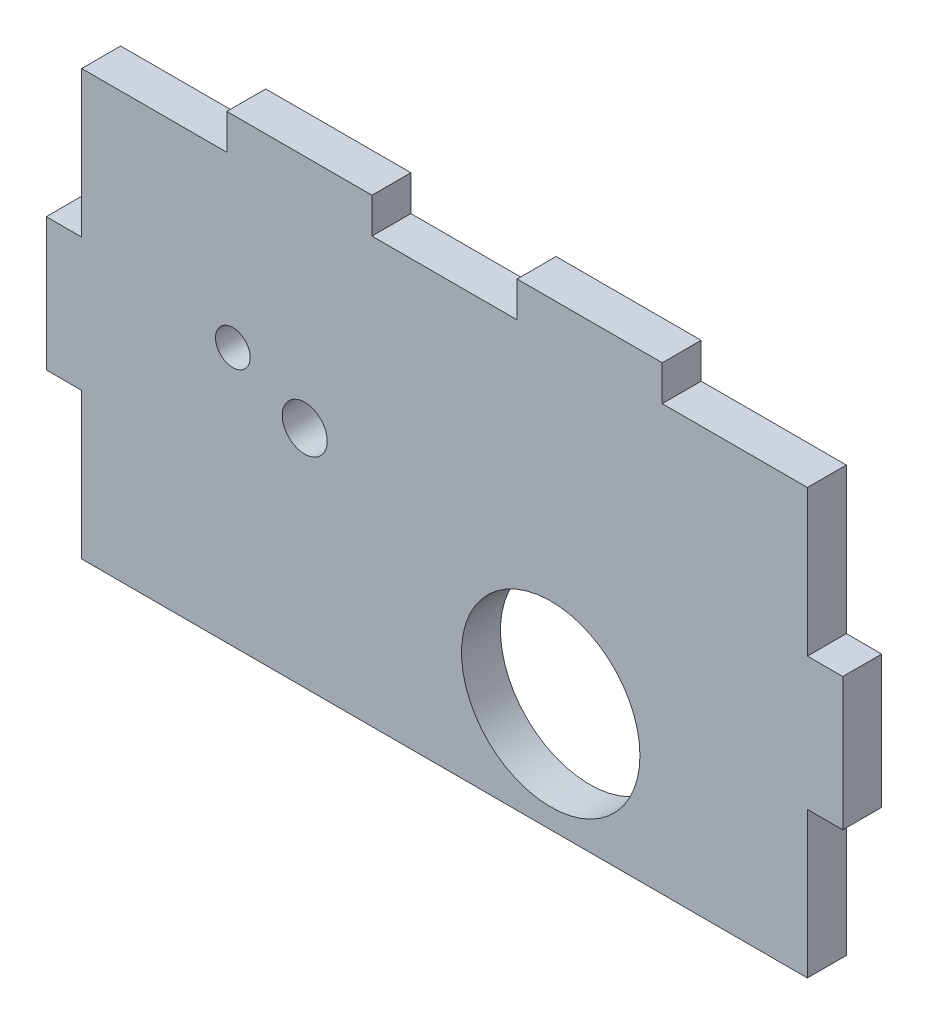
ISO-10303-21;
HEADER;
FILE_DESCRIPTION(('STEP AP214'),'2;1');
FILE_NAME('part.step','',(''),(''),'','','');
FILE_SCHEMA(('AUTOMOTIVE_DESIGN { 1 0 10303 214 1 1 1 1 }'));
ENDSEC;
DATA;
#1=APPLICATION_CONTEXT('core data for automotive mechanical design processes');
#2=APPLICATION_PROTOCOL_DEFINITION('international standard','automotive_design',2000,#1);
#3=PRODUCT_CONTEXT('',#1,'mechanical');
#4=PRODUCT('Part','Part','',(#3));
#5=PRODUCT_RELATED_PRODUCT_CATEGORY('part','',(#4));
#6=PRODUCT_DEFINITION_FORMATION('','',#4);
#7=PRODUCT_DEFINITION_CONTEXT('part definition',#1,'design');
#8=PRODUCT_DEFINITION('design','',#6,#7);
#9=PRODUCT_DEFINITION_SHAPE('','',#8);
#10=(LENGTH_UNIT() NAMED_UNIT(*) SI_UNIT(.MILLI.,.METRE.));
#11=(NAMED_UNIT(*) PLANE_ANGLE_UNIT() SI_UNIT($,.RADIAN.));
#12=(NAMED_UNIT(*) SI_UNIT($,.STERADIAN.) SOLID_ANGLE_UNIT());
#13=UNCERTAINTY_MEASURE_WITH_UNIT(LENGTH_MEASURE(1.E-05),#10,'distance_accuracy_value','');
#14=(GEOMETRIC_REPRESENTATION_CONTEXT(3) GLOBAL_UNCERTAINTY_ASSIGNED_CONTEXT((#13)) GLOBAL_UNIT_ASSIGNED_CONTEXT((#10,
#11,#12)) REPRESENTATION_CONTEXT('',''));
#15=CARTESIAN_POINT('',(0.,0.,0.));
#16=DIRECTION('',(0.,0.,1.));
#17=DIRECTION('',(1.,0.,0.));
#18=AXIS2_PLACEMENT_3D('',#15,#16,#17);
#19=CARTESIAN_POINT('',(0.,0.,5.588));
#20=DIRECTION('',(0.,0.,1.));
#21=DIRECTION('',(1.,0.,0.));
#22=AXIS2_PLACEMENT_3D('',#19,#20,#21);
#23=PLANE('',#22);
#24=CARTESIAN_POINT('',(37.0899556723201,-71.0972176276712,5.588));
#25=DIRECTION('',(0.,0.,1.));
#26=DIRECTION('',(1.,0.,0.));
#27=AXIS2_PLACEMENT_3D('',#24,#25,#26);
#28=CIRCLE('',#27,3.2258000068725);
#29=CARTESIAN_POINT('',(40.3157556791926,-71.0972176276712,5.588));
#30=VERTEX_POINT('',#29);
#31=EDGE_CURVE('E391',#30,#30,#28,.T.);
#32=ORIENTED_EDGE('',*,*,#31,.F.);
#33=EDGE_LOOP('',(#32));
#34=FACE_BOUND('',#33,.T.);
#35=DIRECTION('',(-1.,0.,0.));
#36=VECTOR('',#35,1.);
#37=CARTESIAN_POINT('',(5.07999999998545,-42.3993351543391,5.588));
#38=LINE('',#37,#36);
#39=CARTESIAN_POINT('',(25.9079999999854,-42.3993351543391,5.588));
#40=VERTEX_POINT('',#39);
#41=CARTESIAN_POINT('',(5.07999999998545,-42.3993351543391,5.588));
#42=VERTEX_POINT('',#41);
#43=EDGE_CURVE('E241',#40,#42,#38,.T.);
#44=ORIENTED_EDGE('',*,*,#43,.T.);
#45=DIRECTION('',(0.,-1.,0.));
#46=VECTOR('',#45,1.);
#47=CARTESIAN_POINT('',(5.07999999998545,-42.3993351543391,5.588));
#48=LINE('',#47,#46);
#49=CARTESIAN_POINT('',(5.07999999998545,-63.3543351543391,5.588));
#50=VERTEX_POINT('',#49);
#51=EDGE_CURVE('E129',#42,#50,#48,.T.);
#52=ORIENTED_EDGE('',*,*,#51,.T.);
#53=DIRECTION('',(-1.,0.,0.));
#54=VECTOR('',#53,1.);
#55=CARTESIAN_POINT('',(5.07999999998545,-63.3543351543391,5.588));
#56=LINE('',#55,#54);
#57=CARTESIAN_POINT('',(0.,-63.3543351543391,5.588));
#58=VERTEX_POINT('',#57);
#59=EDGE_CURVE('E292',#50,#58,#56,.T.);
#60=ORIENTED_EDGE('',*,*,#59,.T.);
#61=DIRECTION('',(0.,-1.,0.));
#62=VECTOR('',#61,1.);
#63=CARTESIAN_POINT('',(0.,-63.3543351543391,5.588));
#64=LINE('',#63,#62);
#65=CARTESIAN_POINT('',(0.,-82.4043351543391,5.588));
#66=VERTEX_POINT('',#65);
#67=EDGE_CURVE('E311',#58,#66,#64,.T.);
#68=ORIENTED_EDGE('',*,*,#67,.T.);
#69=DIRECTION('',(1.,0.,0.));
#70=VECTOR('',#69,1.);
#71=CARTESIAN_POINT('',(5.07999999998545,-82.4043351543391,5.588));
#72=LINE('',#71,#70);
#73=CARTESIAN_POINT('',(5.07999999998545,-82.4043351543391,5.588));
#74=VERTEX_POINT('',#73);
#75=EDGE_CURVE('E308',#66,#74,#72,.T.);
#76=ORIENTED_EDGE('',*,*,#75,.T.);
#77=DIRECTION('',(0.,-1.,0.));
#78=VECTOR('',#77,1.);
#79=CARTESIAN_POINT('',(5.07999999998545,-82.4043351543391,5.588));
#80=LINE('',#79,#78);
#81=CARTESIAN_POINT('',(5.07999999998546,-103.359335154339,5.588));
#82=VERTEX_POINT('',#81);
#83=EDGE_CURVE('E310',#74,#82,#80,.T.);
#84=ORIENTED_EDGE('',*,*,#83,.T.);
#85=DIRECTION('',(1.,0.,0.));
#86=VECTOR('',#85,1.);
#87=CARTESIAN_POINT('',(5.07999999998546,-103.359335154339,5.588));
#88=LINE('',#87,#86);
#89=CARTESIAN_POINT('',(109.219999999985,-103.359335154339,5.588));
#90=VERTEX_POINT('',#89);
#91=EDGE_CURVE('E313',#82,#90,#88,.T.);
#92=ORIENTED_EDGE('',*,*,#91,.T.);
#93=DIRECTION('',(0.,1.,0.));
#94=VECTOR('',#93,1.);
#95=CARTESIAN_POINT('',(109.219999999985,-82.404335154339,5.588));
#96=LINE('',#95,#94);
#97=CARTESIAN_POINT('',(109.219999999985,-82.404335154339,5.588));
#98=VERTEX_POINT('',#97);
#99=EDGE_CURVE('E319',#90,#98,#96,.T.);
#100=ORIENTED_EDGE('',*,*,#99,.T.);
#101=DIRECTION('',(1.,0.,0.));
#102=VECTOR('',#101,1.);
#103=CARTESIAN_POINT('',(109.219999999985,-82.404335154339,5.588));
#104=LINE('',#103,#102);
#105=CARTESIAN_POINT('',(114.3,-82.4043351543391,5.588));
#106=VERTEX_POINT('',#105);
#107=EDGE_CURVE('E321',#98,#106,#104,.T.);
#108=ORIENTED_EDGE('',*,*,#107,.T.);
#109=DIRECTION('',(0.,1.,0.));
#110=VECTOR('',#109,1.);
#111=CARTESIAN_POINT('',(114.3,-63.3543351543391,5.588));
#112=LINE('',#111,#110);
#113=CARTESIAN_POINT('',(114.3,-63.3543351543391,5.588));
#114=VERTEX_POINT('',#113);
#115=EDGE_CURVE('E323',#106,#114,#112,.T.);
#116=ORIENTED_EDGE('',*,*,#115,.T.);
#117=DIRECTION('',(-1.,0.,0.));
#118=VECTOR('',#117,1.);
#119=CARTESIAN_POINT('',(109.219999999985,-63.354335154339,5.588));
#120=LINE('',#119,#118);
#121=CARTESIAN_POINT('',(109.219999999985,-63.354335154339,5.588));
#122=VERTEX_POINT('',#121);
#123=EDGE_CURVE('E325',#114,#122,#120,.T.);
#124=ORIENTED_EDGE('',*,*,#123,.T.);
#125=DIRECTION('',(0.,1.,0.));
#126=VECTOR('',#125,1.);
#127=CARTESIAN_POINT('',(109.219999999985,-42.399335154339,5.588));
#128=LINE('',#127,#126);
#129=CARTESIAN_POINT('',(109.219999999985,-42.399335154339,5.588));
#130=VERTEX_POINT('',#129);
#131=EDGE_CURVE('E327',#122,#130,#128,.T.);
#132=ORIENTED_EDGE('',*,*,#131,.T.);
#133=DIRECTION('',(-1.,0.,0.));
#134=VECTOR('',#133,1.);
#135=CARTESIAN_POINT('',(88.3919999999854,-42.399335154339,5.588));
#136=LINE('',#135,#134);
#137=CARTESIAN_POINT('',(88.3919999999854,-42.399335154339,5.588));
#138=VERTEX_POINT('',#137);
#139=EDGE_CURVE('E329',#130,#138,#136,.T.);
#140=ORIENTED_EDGE('',*,*,#139,.T.);
#141=DIRECTION('',(0.,1.,0.));
#142=VECTOR('',#141,1.);
#143=CARTESIAN_POINT('',(88.3919999999854,-42.399335154339,5.588));
#144=LINE('',#143,#142);
#145=CARTESIAN_POINT('',(88.3919999999854,-37.319335154339,5.588));
#146=VERTEX_POINT('',#145);
#147=EDGE_CURVE('E331',#138,#146,#144,.T.);
#148=ORIENTED_EDGE('',*,*,#147,.T.);
#149=DIRECTION('',(-1.,0.,0.));
#150=VECTOR('',#149,1.);
#151=CARTESIAN_POINT('',(67.5639999999854,-37.319335154339,5.588));
#152=LINE('',#151,#150);
#153=CARTESIAN_POINT('',(67.5639999999854,-37.319335154339,5.588));
#154=VERTEX_POINT('',#153);
#155=EDGE_CURVE('E333',#146,#154,#152,.T.);
#156=ORIENTED_EDGE('',*,*,#155,.T.);
#157=DIRECTION('',(0.,-1.,0.));
#158=VECTOR('',#157,1.);
#159=CARTESIAN_POINT('',(67.5639999999854,-42.399335154339,5.588));
#160=LINE('',#159,#158);
#161=CARTESIAN_POINT('',(67.5639999999854,-42.399335154339,5.588));
#162=VERTEX_POINT('',#161);
#163=EDGE_CURVE('E335',#154,#162,#160,.T.);
#164=ORIENTED_EDGE('',*,*,#163,.T.);
#165=DIRECTION('',(-1.,0.,0.));
#166=VECTOR('',#165,1.);
#167=CARTESIAN_POINT('',(46.7359999999854,-42.3993351543391,5.588));
#168=LINE('',#167,#166);
#169=CARTESIAN_POINT('',(46.7359999999854,-42.3993351543391,5.588));
#170=VERTEX_POINT('',#169);
#171=EDGE_CURVE('E184',#162,#170,#168,.T.);
#172=ORIENTED_EDGE('',*,*,#171,.T.);
#173=DIRECTION('',(0.,1.,0.));
#174=VECTOR('',#173,1.);
#175=CARTESIAN_POINT('',(46.7359999999854,-42.3993351543391,5.588));
#176=LINE('',#175,#174);
#177=CARTESIAN_POINT('',(46.7359999999854,-37.319335154339,5.588));
#178=VERTEX_POINT('',#177);
#179=EDGE_CURVE('E178',#170,#178,#176,.T.);
#180=ORIENTED_EDGE('',*,*,#179,.T.);
#181=DIRECTION('',(-1.,0.,0.));
#182=VECTOR('',#181,1.);
#183=CARTESIAN_POINT('',(25.9079999999854,-37.319335154339,5.588));
#184=LINE('',#183,#182);
#185=CARTESIAN_POINT('',(25.9079999999854,-37.319335154339,5.588));
#186=VERTEX_POINT('',#185);
#187=EDGE_CURVE('E182',#178,#186,#184,.T.);
#188=ORIENTED_EDGE('',*,*,#187,.T.);
#189=DIRECTION('',(0.,-1.,0.));
#190=VECTOR('',#189,1.);
#191=CARTESIAN_POINT('',(25.9079999999854,-42.3993351543391,5.588));
#192=LINE('',#191,#190);
#193=EDGE_CURVE('E50',#186,#40,#192,.T.);
#194=ORIENTED_EDGE('',*,*,#193,.T.);
#195=EDGE_LOOP('',(#44,#52,#60,#68,#76,#84,#92,#100,#108,#116,#124,#132,#140,#148,#156,#164,
#172,#180,#188,#194));
#196=FACE_BOUND('',#195,.T.);
#197=CARTESIAN_POINT('',(26.7727338848748,-66.2371933737541,5.588));
#198=DIRECTION('',(0.,0.,1.));
#199=DIRECTION('',(1.,0.,0.));
#200=AXIS2_PLACEMENT_3D('',#197,#198,#199);
#201=CIRCLE('',#200,2.4892000068725);
#202=CARTESIAN_POINT('',(29.2619338917473,-66.2371933737541,5.588));
#203=VERTEX_POINT('',#202);
#204=EDGE_CURVE('E206',#203,#203,#201,.T.);
#205=ORIENTED_EDGE('',*,*,#204,.F.);
#206=EDGE_LOOP('',(#205));
#207=FACE_BOUND('',#206,.T.);
#208=CARTESIAN_POINT('',(72.3900000000002,-87.725635154339,5.588));
#209=DIRECTION('',(0.,0.,1.));
#210=DIRECTION('',(1.,0.,0.));
#211=AXIS2_PLACEMENT_3D('',#208,#209,#210);
#212=CIRCLE('',#211,12.8016000048525);
#213=CARTESIAN_POINT('',(85.1916000048526,-87.725635154339,5.588));
#214=VERTEX_POINT('',#213);
#215=EDGE_CURVE('E382',#214,#214,#212,.T.);
#216=ORIENTED_EDGE('',*,*,#215,.F.);
#217=EDGE_LOOP('',(#216));
#218=FACE_BOUND('',#217,.T.);
#219=ADVANCED_FACE('F33',(#34,#196,#207,#218),#23,.T.);
#220=CARTESIAN_POINT('',(0.,0.,0.));
#221=DIRECTION('',(0.,0.,1.));
#222=DIRECTION('',(1.,0.,0.));
#223=AXIS2_PLACEMENT_3D('',#220,#221,#222);
#224=PLANE('',#223);
#225=CARTESIAN_POINT('',(37.0899556723201,-71.0972176276712,0.));
#226=DIRECTION('',(0.,0.,1.));
#227=DIRECTION('',(1.,0.,0.));
#228=AXIS2_PLACEMENT_3D('',#225,#226,#227);
#229=CIRCLE('',#228,3.2258000068725);
#230=CARTESIAN_POINT('',(40.3157556791926,-71.0972176276712,0.));
#231=VERTEX_POINT('',#230);
#232=EDGE_CURVE('E388',#231,#231,#229,.T.);
#233=ORIENTED_EDGE('',*,*,#232,.T.);
#234=EDGE_LOOP('',(#233));
#235=FACE_BOUND('',#234,.T.);
#236=DIRECTION('',(-1.,0.,0.));
#237=VECTOR('',#236,1.);
#238=CARTESIAN_POINT('',(5.07999999998545,-42.3993351543391,0.));
#239=LINE('',#238,#237);
#240=CARTESIAN_POINT('',(25.9079999999854,-42.3993351543391,0.));
#241=VERTEX_POINT('',#240);
#242=CARTESIAN_POINT('',(5.07999999998545,-42.3993351543391,0.));
#243=VERTEX_POINT('',#242);
#244=EDGE_CURVE('E202',#241,#243,#239,.T.);
#245=ORIENTED_EDGE('',*,*,#244,.F.);
#246=DIRECTION('',(0.,-1.,0.));
#247=VECTOR('',#246,1.);
#248=CARTESIAN_POINT('',(25.9079999999854,-42.3993351543391,0.));
#249=LINE('',#248,#247);
#250=CARTESIAN_POINT('',(25.9079999999854,-37.319335154339,0.));
#251=VERTEX_POINT('',#250);
#252=EDGE_CURVE('E121',#251,#241,#249,.T.);
#253=ORIENTED_EDGE('',*,*,#252,.F.);
#254=DIRECTION('',(-1.,0.,0.));
#255=VECTOR('',#254,1.);
#256=CARTESIAN_POINT('',(25.9079999999854,-37.319335154339,0.));
#257=LINE('',#256,#255);
#258=CARTESIAN_POINT('',(46.7359999999854,-37.319335154339,0.));
#259=VERTEX_POINT('',#258);
#260=EDGE_CURVE('E115',#259,#251,#257,.T.);
#261=ORIENTED_EDGE('',*,*,#260,.F.);
#262=DIRECTION('',(0.,1.,0.));
#263=VECTOR('',#262,1.);
#264=CARTESIAN_POINT('',(46.7359999999854,-42.3993351543391,0.));
#265=LINE('',#264,#263);
#266=CARTESIAN_POINT('',(46.7359999999854,-42.3993351543391,0.));
#267=VERTEX_POINT('',#266);
#268=EDGE_CURVE('E192',#267,#259,#265,.T.);
#269=ORIENTED_EDGE('',*,*,#268,.F.);
#270=DIRECTION('',(-1.,0.,0.));
#271=VECTOR('',#270,1.);
#272=CARTESIAN_POINT('',(46.7359999999854,-42.3993351543391,0.));
#273=LINE('',#272,#271);
#274=CARTESIAN_POINT('',(67.5639999999854,-42.399335154339,0.));
#275=VERTEX_POINT('',#274);
#276=EDGE_CURVE('E236',#275,#267,#273,.T.);
#277=ORIENTED_EDGE('',*,*,#276,.F.);
#278=DIRECTION('',(0.,-1.,0.));
#279=VECTOR('',#278,1.);
#280=CARTESIAN_POINT('',(67.5639999999854,-42.399335154339,0.));
#281=LINE('',#280,#279);
#282=CARTESIAN_POINT('',(67.5639999999854,-37.319335154339,0.));
#283=VERTEX_POINT('',#282);
#284=EDGE_CURVE('E234',#283,#275,#281,.T.);
#285=ORIENTED_EDGE('',*,*,#284,.F.);
#286=DIRECTION('',(-1.,0.,0.));
#287=VECTOR('',#286,1.);
#288=CARTESIAN_POINT('',(67.5639999999854,-37.319335154339,0.));
#289=LINE('',#288,#287);
#290=CARTESIAN_POINT('',(88.3919999999854,-37.319335154339,0.));
#291=VERTEX_POINT('',#290);
#292=EDGE_CURVE('E232',#291,#283,#289,.T.);
#293=ORIENTED_EDGE('',*,*,#292,.F.);
#294=DIRECTION('',(0.,1.,0.));
#295=VECTOR('',#294,1.);
#296=CARTESIAN_POINT('',(88.3919999999854,-42.399335154339,0.));
#297=LINE('',#296,#295);
#298=CARTESIAN_POINT('',(88.3919999999854,-42.399335154339,0.));
#299=VERTEX_POINT('',#298);
#300=EDGE_CURVE('E230',#299,#291,#297,.T.);
#301=ORIENTED_EDGE('',*,*,#300,.F.);
#302=DIRECTION('',(-1.,0.,0.));
#303=VECTOR('',#302,1.);
#304=CARTESIAN_POINT('',(88.3919999999854,-42.399335154339,0.));
#305=LINE('',#304,#303);
#306=CARTESIAN_POINT('',(109.219999999985,-42.399335154339,0.));
#307=VERTEX_POINT('',#306);
#308=EDGE_CURVE('E228',#307,#299,#305,.T.);
#309=ORIENTED_EDGE('',*,*,#308,.F.);
#310=DIRECTION('',(0.,1.,0.));
#311=VECTOR('',#310,1.);
#312=CARTESIAN_POINT('',(109.219999999985,-42.399335154339,0.));
#313=LINE('',#312,#311);
#314=CARTESIAN_POINT('',(109.219999999985,-63.354335154339,0.));
#315=VERTEX_POINT('',#314);
#316=EDGE_CURVE('E226',#315,#307,#313,.T.);
#317=ORIENTED_EDGE('',*,*,#316,.F.);
#318=DIRECTION('',(-1.,0.,0.));
#319=VECTOR('',#318,1.);
#320=CARTESIAN_POINT('',(109.219999999985,-63.354335154339,0.));
#321=LINE('',#320,#319);
#322=CARTESIAN_POINT('',(114.3,-63.3543351543391,0.));
#323=VERTEX_POINT('',#322);
#324=EDGE_CURVE('E224',#323,#315,#321,.T.);
#325=ORIENTED_EDGE('',*,*,#324,.F.);
#326=DIRECTION('',(0.,1.,0.));
#327=VECTOR('',#326,1.);
#328=CARTESIAN_POINT('',(114.3,-63.3543351543391,0.));
#329=LINE('',#328,#327);
#330=CARTESIAN_POINT('',(114.3,-82.4043351543391,0.));
#331=VERTEX_POINT('',#330);
#332=EDGE_CURVE('E222',#331,#323,#329,.T.);
#333=ORIENTED_EDGE('',*,*,#332,.F.);
#334=DIRECTION('',(1.,0.,0.));
#335=VECTOR('',#334,1.);
#336=CARTESIAN_POINT('',(109.219999999985,-82.404335154339,0.));
#337=LINE('',#336,#335);
#338=CARTESIAN_POINT('',(109.219999999985,-82.404335154339,0.));
#339=VERTEX_POINT('',#338);
#340=EDGE_CURVE('E220',#339,#331,#337,.T.);
#341=ORIENTED_EDGE('',*,*,#340,.F.);
#342=DIRECTION('',(0.,1.,0.));
#343=VECTOR('',#342,1.);
#344=CARTESIAN_POINT('',(109.219999999985,-82.404335154339,0.));
#345=LINE('',#344,#343);
#346=CARTESIAN_POINT('',(109.219999999985,-103.359335154339,0.));
#347=VERTEX_POINT('',#346);
#348=EDGE_CURVE('E218',#347,#339,#345,.T.);
#349=ORIENTED_EDGE('',*,*,#348,.F.);
#350=DIRECTION('',(1.,0.,0.));
#351=VECTOR('',#350,1.);
#352=CARTESIAN_POINT('',(5.07999999998546,-103.359335154339,0.));
#353=LINE('',#352,#351);
#354=CARTESIAN_POINT('',(5.07999999998546,-103.359335154339,0.));
#355=VERTEX_POINT('',#354);
#356=EDGE_CURVE('E216',#355,#347,#353,.T.);
#357=ORIENTED_EDGE('',*,*,#356,.F.);
#358=DIRECTION('',(0.,-1.,0.));
#359=VECTOR('',#358,1.);
#360=CARTESIAN_POINT('',(5.07999999998545,-82.4043351543391,0.));
#361=LINE('',#360,#359);
#362=CARTESIAN_POINT('',(5.07999999998545,-82.4043351543391,0.));
#363=VERTEX_POINT('',#362);
#364=EDGE_CURVE('E214',#363,#355,#361,.T.);
#365=ORIENTED_EDGE('',*,*,#364,.F.);
#366=DIRECTION('',(1.,0.,0.));
#367=VECTOR('',#366,1.);
#368=CARTESIAN_POINT('',(5.07999999998545,-82.4043351543391,0.));
#369=LINE('',#368,#367);
#370=CARTESIAN_POINT('',(0.,-82.4043351543391,0.));
#371=VERTEX_POINT('',#370);
#372=EDGE_CURVE('E212',#371,#363,#369,.T.);
#373=ORIENTED_EDGE('',*,*,#372,.F.);
#374=DIRECTION('',(0.,-1.,0.));
#375=VECTOR('',#374,1.);
#376=CARTESIAN_POINT('',(0.,-63.3543351543391,0.));
#377=LINE('',#376,#375);
#378=CARTESIAN_POINT('',(0.,-63.3543351543391,0.));
#379=VERTEX_POINT('',#378);
#380=EDGE_CURVE('E210',#379,#371,#377,.T.);
#381=ORIENTED_EDGE('',*,*,#380,.F.);
#382=DIRECTION('',(-1.,0.,0.));
#383=VECTOR('',#382,1.);
#384=CARTESIAN_POINT('',(5.07999999998545,-63.3543351543391,0.));
#385=LINE('',#384,#383);
#386=CARTESIAN_POINT('',(5.07999999998545,-63.3543351543391,0.));
#387=VERTEX_POINT('',#386);
#388=EDGE_CURVE('E208',#387,#379,#385,.T.);
#389=ORIENTED_EDGE('',*,*,#388,.F.);
#390=DIRECTION('',(0.,-1.,0.));
#391=VECTOR('',#390,1.);
#392=CARTESIAN_POINT('',(5.07999999998545,-42.3993351543391,0.));
#393=LINE('',#392,#391);
#394=EDGE_CURVE('E205',#243,#387,#393,.T.);
#395=ORIENTED_EDGE('',*,*,#394,.F.);
#396=EDGE_LOOP('',(#245,#253,#261,#269,#277,#285,#293,#301,#309,#317,#325,#333,#341,#349,#357,
#365,#373,#381,#389,#395));
#397=FACE_BOUND('',#396,.T.);
#398=CARTESIAN_POINT('',(26.7727338848748,-66.2371933737541,0.));
#399=DIRECTION('',(0.,0.,1.));
#400=DIRECTION('',(1.,0.,0.));
#401=AXIS2_PLACEMENT_3D('',#398,#399,#400);
#402=CIRCLE('',#401,2.4892000068725);
#403=CARTESIAN_POINT('',(29.2619338917473,-66.2371933737541,0.));
#404=VERTEX_POINT('',#403);
#405=EDGE_CURVE('E394',#404,#404,#402,.T.);
#406=ORIENTED_EDGE('',*,*,#405,.T.);
#407=EDGE_LOOP('',(#406));
#408=FACE_BOUND('',#407,.T.);
#409=CARTESIAN_POINT('',(72.3900000000002,-87.725635154339,0.));
#410=DIRECTION('',(0.,0.,1.));
#411=DIRECTION('',(1.,0.,0.));
#412=AXIS2_PLACEMENT_3D('',#409,#410,#411);
#413=CIRCLE('',#412,12.8016000048525);
#414=CARTESIAN_POINT('',(85.1916000048526,-87.725635154339,0.));
#415=VERTEX_POINT('',#414);
#416=EDGE_CURVE('E385',#415,#415,#413,.T.);
#417=ORIENTED_EDGE('',*,*,#416,.T.);
#418=EDGE_LOOP('',(#417));
#419=FACE_BOUND('',#418,.T.);
#420=ADVANCED_FACE('F296',(#235,#397,#408,#419),#224,.F.);
#421=CARTESIAN_POINT('',(5.07999999998545,-42.3993351543391,5.588));
#422=DIRECTION('',(0.,-1.,0.));
#423=DIRECTION('',(1.,0.,0.));
#424=AXIS2_PLACEMENT_3D('',#421,#422,#423);
#425=PLANE('',#424);
#426=ORIENTED_EDGE('',*,*,#244,.T.);
#427=DIRECTION('',(0.,0.,-1.));
#428=VECTOR('',#427,1.);
#429=CARTESIAN_POINT('',(5.07999999998545,-42.3993351543391,5.588));
#430=LINE('',#429,#428);
#431=EDGE_CURVE('E11',#42,#243,#430,.T.);
#432=ORIENTED_EDGE('',*,*,#431,.F.);
#433=ORIENTED_EDGE('',*,*,#43,.F.);
#434=DIRECTION('',(0.,0.,-1.));
#435=VECTOR('',#434,1.);
#436=CARTESIAN_POINT('',(25.9079999999854,-42.3993351543391,5.588));
#437=LINE('',#436,#435);
#438=EDGE_CURVE('E198',#40,#241,#437,.T.);
#439=ORIENTED_EDGE('',*,*,#438,.T.);
#440=EDGE_LOOP('',(#426,#432,#433,#439));
#441=FACE_BOUND('',#440,.T.);
#442=ADVANCED_FACE('F35',(#441),#425,.F.);
#443=CARTESIAN_POINT('',(5.07999999998545,-42.3993351543391,5.588));
#444=DIRECTION('',(1.,0.,0.));
#445=DIRECTION('',(0.,1.,0.));
#446=AXIS2_PLACEMENT_3D('',#443,#444,#445);
#447=PLANE('',#446);
#448=ORIENTED_EDGE('',*,*,#394,.T.);
#449=DIRECTION('',(0.,0.,-1.));
#450=VECTOR('',#449,1.);
#451=CARTESIAN_POINT('',(5.07999999998545,-63.3543351543391,5.588));
#452=LINE('',#451,#450);
#453=EDGE_CURVE('E42',#50,#387,#452,.T.);
#454=ORIENTED_EDGE('',*,*,#453,.F.);
#455=ORIENTED_EDGE('',*,*,#51,.F.);
#456=ORIENTED_EDGE('',*,*,#431,.T.);
#457=EDGE_LOOP('',(#448,#454,#455,#456));
#458=FACE_BOUND('',#457,.T.);
#459=ADVANCED_FACE('F575',(#458),#447,.F.);
#460=CARTESIAN_POINT('',(5.07999999998545,-63.3543351543391,5.588));
#461=DIRECTION('',(0.,-1.,0.));
#462=DIRECTION('',(0.,0.,-1.));
#463=AXIS2_PLACEMENT_3D('',#460,#461,#462);
#464=PLANE('',#463);
#465=ORIENTED_EDGE('',*,*,#388,.T.);
#466=DIRECTION('',(0.,0.,-1.));
#467=VECTOR('',#466,1.);
#468=CARTESIAN_POINT('',(0.,-63.3543351543391,5.588));
#469=LINE('',#468,#467);
#470=EDGE_CURVE('E284',#58,#379,#469,.T.);
#471=ORIENTED_EDGE('',*,*,#470,.F.);
#472=ORIENTED_EDGE('',*,*,#59,.F.);
#473=ORIENTED_EDGE('',*,*,#453,.T.);
#474=EDGE_LOOP('',(#465,#471,#472,#473));
#475=FACE_BOUND('',#474,.T.);
#476=ADVANCED_FACE('F290',(#475),#464,.F.);
#477=CARTESIAN_POINT('',(0.,-63.3543351543391,5.588));
#478=DIRECTION('',(1.,0.,0.));
#479=DIRECTION('',(0.,0.,-1.));
#480=AXIS2_PLACEMENT_3D('',#477,#478,#479);
#481=PLANE('',#480);
#482=ORIENTED_EDGE('',*,*,#380,.T.);
#483=DIRECTION('',(0.,0.,-1.));
#484=VECTOR('',#483,1.);
#485=CARTESIAN_POINT('',(0.,-82.4043351543391,5.588));
#486=LINE('',#485,#484);
#487=EDGE_CURVE('E281',#66,#371,#486,.T.);
#488=ORIENTED_EDGE('',*,*,#487,.F.);
#489=ORIENTED_EDGE('',*,*,#67,.F.);
#490=ORIENTED_EDGE('',*,*,#470,.T.);
#491=EDGE_LOOP('',(#482,#488,#489,#490));
#492=FACE_BOUND('',#491,.T.);
#493=ADVANCED_FACE('F302',(#492),#481,.F.);
#494=CARTESIAN_POINT('',(5.07999999998545,-82.4043351543391,5.588));
#495=DIRECTION('',(0.,1.,0.));
#496=DIRECTION('',(0.,0.,1.));
#497=AXIS2_PLACEMENT_3D('',#494,#495,#496);
#498=PLANE('',#497);
#499=ORIENTED_EDGE('',*,*,#372,.T.);
#500=DIRECTION('',(0.,0.,-1.));
#501=VECTOR('',#500,1.);
#502=CARTESIAN_POINT('',(5.07999999998545,-82.4043351543391,5.588));
#503=LINE('',#502,#501);
#504=EDGE_CURVE('E278',#74,#363,#503,.T.);
#505=ORIENTED_EDGE('',*,*,#504,.F.);
#506=ORIENTED_EDGE('',*,*,#75,.F.);
#507=ORIENTED_EDGE('',*,*,#487,.T.);
#508=EDGE_LOOP('',(#499,#505,#506,#507));
#509=FACE_BOUND('',#508,.T.);
#510=ADVANCED_FACE('F306',(#509),#498,.F.);
#511=CARTESIAN_POINT('',(5.07999999998545,-82.4043351543391,5.588));
#512=DIRECTION('',(1.,0.,0.));
#513=DIRECTION('',(0.,1.,0.));
#514=AXIS2_PLACEMENT_3D('',#511,#512,#513);
#515=PLANE('',#514);
#516=ORIENTED_EDGE('',*,*,#364,.T.);
#517=DIRECTION('',(0.,0.,-1.));
#518=VECTOR('',#517,1.);
#519=CARTESIAN_POINT('',(5.07999999998546,-103.359335154339,5.588));
#520=LINE('',#519,#518);
#521=EDGE_CURVE('E275',#82,#355,#520,.T.);
#522=ORIENTED_EDGE('',*,*,#521,.F.);
#523=ORIENTED_EDGE('',*,*,#83,.F.);
#524=ORIENTED_EDGE('',*,*,#504,.T.);
#525=EDGE_LOOP('',(#516,#522,#523,#524));
#526=FACE_BOUND('',#525,.T.);
#527=ADVANCED_FACE('F540',(#526),#515,.F.);
#528=CARTESIAN_POINT('',(5.07999999998546,-103.359335154339,5.588));
#529=DIRECTION('',(0.,1.,0.));
#530=DIRECTION('',(-1.,0.,0.));
#531=AXIS2_PLACEMENT_3D('',#528,#529,#530);
#532=PLANE('',#531);
#533=ORIENTED_EDGE('',*,*,#356,.T.);
#534=DIRECTION('',(0.,0.,-1.));
#535=VECTOR('',#534,1.);
#536=CARTESIAN_POINT('',(109.219999999985,-103.359335154339,5.588));
#537=LINE('',#536,#535);
#538=EDGE_CURVE('E272',#90,#347,#537,.T.);
#539=ORIENTED_EDGE('',*,*,#538,.F.);
#540=ORIENTED_EDGE('',*,*,#91,.F.);
#541=ORIENTED_EDGE('',*,*,#521,.T.);
#542=EDGE_LOOP('',(#533,#539,#540,#541));
#543=FACE_BOUND('',#542,.T.);
#544=ADVANCED_FACE('F530',(#543),#532,.F.);
#545=CARTESIAN_POINT('',(109.219999999985,-82.404335154339,5.588));
#546=DIRECTION('',(-1.,0.,0.));
#547=DIRECTION('',(0.,0.,1.));
#548=AXIS2_PLACEMENT_3D('',#545,#546,#547);
#549=PLANE('',#548);
#550=ORIENTED_EDGE('',*,*,#348,.T.);
#551=DIRECTION('',(0.,0.,-1.));
#552=VECTOR('',#551,1.);
#553=CARTESIAN_POINT('',(109.219999999985,-82.404335154339,5.588));
#554=LINE('',#553,#552);
#555=EDGE_CURVE('E269',#98,#339,#554,.T.);
#556=ORIENTED_EDGE('',*,*,#555,.F.);
#557=ORIENTED_EDGE('',*,*,#99,.F.);
#558=ORIENTED_EDGE('',*,*,#538,.T.);
#559=EDGE_LOOP('',(#550,#556,#557,#558));
#560=FACE_BOUND('',#559,.T.);
#561=ADVANCED_FACE('F520',(#560),#549,.F.);
#562=CARTESIAN_POINT('',(109.219999999985,-82.404335154339,5.588));
#563=DIRECTION('',(0.,1.,0.));
#564=DIRECTION('',(-1.,0.,0.));
#565=AXIS2_PLACEMENT_3D('',#562,#563,#564);
#566=PLANE('',#565);
#567=ORIENTED_EDGE('',*,*,#340,.T.);
#568=DIRECTION('',(0.,0.,-1.));
#569=VECTOR('',#568,1.);
#570=CARTESIAN_POINT('',(114.3,-82.4043351543391,5.588));
#571=LINE('',#570,#569);
#572=EDGE_CURVE('E266',#106,#331,#571,.T.);
#573=ORIENTED_EDGE('',*,*,#572,.F.);
#574=ORIENTED_EDGE('',*,*,#107,.F.);
#575=ORIENTED_EDGE('',*,*,#555,.T.);
#576=EDGE_LOOP('',(#567,#573,#574,#575));
#577=FACE_BOUND('',#576,.T.);
#578=ADVANCED_FACE('F510',(#577),#566,.F.);
#579=CARTESIAN_POINT('',(114.3,-63.3543351543391,5.588));
#580=DIRECTION('',(-1.,0.,0.));
#581=DIRECTION('',(0.,0.,1.));
#582=AXIS2_PLACEMENT_3D('',#579,#580,#581);
#583=PLANE('',#582);
#584=ORIENTED_EDGE('',*,*,#332,.T.);
#585=DIRECTION('',(0.,0.,-1.));
#586=VECTOR('',#585,1.);
#587=CARTESIAN_POINT('',(114.3,-63.3543351543391,5.588));
#588=LINE('',#587,#586);
#589=EDGE_CURVE('E263',#114,#323,#588,.T.);
#590=ORIENTED_EDGE('',*,*,#589,.F.);
#591=ORIENTED_EDGE('',*,*,#115,.F.);
#592=ORIENTED_EDGE('',*,*,#572,.T.);
#593=EDGE_LOOP('',(#584,#590,#591,#592));
#594=FACE_BOUND('',#593,.T.);
#595=ADVANCED_FACE('F500',(#594),#583,.F.);
#596=CARTESIAN_POINT('',(109.219999999985,-63.354335154339,5.588));
#597=DIRECTION('',(0.,-1.,0.));
#598=DIRECTION('',(1.,0.,0.));
#599=AXIS2_PLACEMENT_3D('',#596,#597,#598);
#600=PLANE('',#599);
#601=ORIENTED_EDGE('',*,*,#324,.T.);
#602=DIRECTION('',(0.,0.,-1.));
#603=VECTOR('',#602,1.);
#604=CARTESIAN_POINT('',(109.219999999985,-63.354335154339,5.588));
#605=LINE('',#604,#603);
#606=EDGE_CURVE('E260',#122,#315,#605,.T.);
#607=ORIENTED_EDGE('',*,*,#606,.F.);
#608=ORIENTED_EDGE('',*,*,#123,.F.);
#609=ORIENTED_EDGE('',*,*,#589,.T.);
#610=EDGE_LOOP('',(#601,#607,#608,#609));
#611=FACE_BOUND('',#610,.T.);
#612=ADVANCED_FACE('F490',(#611),#600,.F.);
#613=CARTESIAN_POINT('',(109.219999999985,-42.399335154339,5.588));
#614=DIRECTION('',(-1.,0.,0.));
#615=DIRECTION('',(0.,0.,1.));
#616=AXIS2_PLACEMENT_3D('',#613,#614,#615);
#617=PLANE('',#616);
#618=ORIENTED_EDGE('',*,*,#316,.T.);
#619=DIRECTION('',(0.,0.,-1.));
#620=VECTOR('',#619,1.);
#621=CARTESIAN_POINT('',(109.219999999985,-42.399335154339,5.588));
#622=LINE('',#621,#620);
#623=EDGE_CURVE('E257',#130,#307,#622,.T.);
#624=ORIENTED_EDGE('',*,*,#623,.F.);
#625=ORIENTED_EDGE('',*,*,#131,.F.);
#626=ORIENTED_EDGE('',*,*,#606,.T.);
#627=EDGE_LOOP('',(#618,#624,#625,#626));
#628=FACE_BOUND('',#627,.T.);
#629=ADVANCED_FACE('F480',(#628),#617,.F.);
#630=CARTESIAN_POINT('',(88.3919999999854,-42.399335154339,5.588));
#631=DIRECTION('',(0.,-1.,0.));
#632=DIRECTION('',(1.,0.,0.));
#633=AXIS2_PLACEMENT_3D('',#630,#631,#632);
#634=PLANE('',#633);
#635=ORIENTED_EDGE('',*,*,#308,.T.);
#636=DIRECTION('',(0.,0.,-1.));
#637=VECTOR('',#636,1.);
#638=CARTESIAN_POINT('',(88.3919999999854,-42.399335154339,5.588));
#639=LINE('',#638,#637);
#640=EDGE_CURVE('E254',#138,#299,#639,.T.);
#641=ORIENTED_EDGE('',*,*,#640,.F.);
#642=ORIENTED_EDGE('',*,*,#139,.F.);
#643=ORIENTED_EDGE('',*,*,#623,.T.);
#644=EDGE_LOOP('',(#635,#641,#642,#643));
#645=FACE_BOUND('',#644,.T.);
#646=ADVANCED_FACE('F470',(#645),#634,.F.);
#647=CARTESIAN_POINT('',(88.3919999999854,-42.399335154339,5.588));
#648=DIRECTION('',(-1.,0.,0.));
#649=DIRECTION('',(0.,0.,1.));
#650=AXIS2_PLACEMENT_3D('',#647,#648,#649);
#651=PLANE('',#650);
#652=ORIENTED_EDGE('',*,*,#300,.T.);
#653=DIRECTION('',(0.,0.,-1.));
#654=VECTOR('',#653,1.);
#655=CARTESIAN_POINT('',(88.3919999999854,-37.319335154339,5.588));
#656=LINE('',#655,#654);
#657=EDGE_CURVE('E251',#146,#291,#656,.T.);
#658=ORIENTED_EDGE('',*,*,#657,.F.);
#659=ORIENTED_EDGE('',*,*,#147,.F.);
#660=ORIENTED_EDGE('',*,*,#640,.T.);
#661=EDGE_LOOP('',(#652,#658,#659,#660));
#662=FACE_BOUND('',#661,.T.);
#663=ADVANCED_FACE('F460',(#662),#651,.F.);
#664=CARTESIAN_POINT('',(67.5639999999854,-37.319335154339,5.588));
#665=DIRECTION('',(0.,-1.,0.));
#666=DIRECTION('',(0.,0.,-1.));
#667=AXIS2_PLACEMENT_3D('',#664,#665,#666);
#668=PLANE('',#667);
#669=ORIENTED_EDGE('',*,*,#292,.T.);
#670=DIRECTION('',(0.,0.,-1.));
#671=VECTOR('',#670,1.);
#672=CARTESIAN_POINT('',(67.5639999999854,-37.319335154339,5.588));
#673=LINE('',#672,#671);
#674=EDGE_CURVE('E248',#154,#283,#673,.T.);
#675=ORIENTED_EDGE('',*,*,#674,.F.);
#676=ORIENTED_EDGE('',*,*,#155,.F.);
#677=ORIENTED_EDGE('',*,*,#657,.T.);
#678=EDGE_LOOP('',(#669,#675,#676,#677));
#679=FACE_BOUND('',#678,.T.);
#680=ADVANCED_FACE('F451',(#679),#668,.F.);
#681=CARTESIAN_POINT('',(67.5639999999854,-42.399335154339,5.588));
#682=DIRECTION('',(1.,0.,0.));
#683=DIRECTION('',(0.,0.,-1.));
#684=AXIS2_PLACEMENT_3D('',#681,#682,#683);
#685=PLANE('',#684);
#686=ORIENTED_EDGE('',*,*,#284,.T.);
#687=DIRECTION('',(0.,0.,-1.));
#688=VECTOR('',#687,1.);
#689=CARTESIAN_POINT('',(67.5639999999854,-42.399335154339,5.588));
#690=LINE('',#689,#688);
#691=EDGE_CURVE('E245',#162,#275,#690,.T.);
#692=ORIENTED_EDGE('',*,*,#691,.F.);
#693=ORIENTED_EDGE('',*,*,#163,.F.);
#694=ORIENTED_EDGE('',*,*,#674,.T.);
#695=EDGE_LOOP('',(#686,#692,#693,#694));
#696=FACE_BOUND('',#695,.T.);
#697=ADVANCED_FACE('F341',(#696),#685,.F.);
#698=CARTESIAN_POINT('',(46.7359999999854,-42.3993351543391,5.588));
#699=DIRECTION('',(0.,-1.,0.));
#700=DIRECTION('',(1.,0.,0.));
#701=AXIS2_PLACEMENT_3D('',#698,#699,#700);
#702=PLANE('',#701);
#703=ORIENTED_EDGE('',*,*,#276,.T.);
#704=DIRECTION('',(0.,0.,-1.));
#705=VECTOR('',#704,1.);
#706=CARTESIAN_POINT('',(46.7359999999854,-42.3993351543391,5.588));
#707=LINE('',#706,#705);
#708=EDGE_CURVE('E193',#170,#267,#707,.T.);
#709=ORIENTED_EDGE('',*,*,#708,.F.);
#710=ORIENTED_EDGE('',*,*,#171,.F.);
#711=ORIENTED_EDGE('',*,*,#691,.T.);
#712=EDGE_LOOP('',(#703,#709,#710,#711));
#713=FACE_BOUND('',#712,.T.);
#714=ADVANCED_FACE('F345',(#713),#702,.F.);
#715=CARTESIAN_POINT('',(46.7359999999854,-42.3993351543391,5.588));
#716=DIRECTION('',(-1.,0.,0.));
#717=DIRECTION('',(0.,0.,1.));
#718=AXIS2_PLACEMENT_3D('',#715,#716,#717);
#719=PLANE('',#718);
#720=ORIENTED_EDGE('',*,*,#268,.T.);
#721=DIRECTION('',(0.,0.,-1.));
#722=VECTOR('',#721,1.);
#723=CARTESIAN_POINT('',(46.7359999999854,-37.319335154339,5.588));
#724=LINE('',#723,#722);
#725=EDGE_CURVE('E189',#178,#259,#724,.T.);
#726=ORIENTED_EDGE('',*,*,#725,.F.);
#727=ORIENTED_EDGE('',*,*,#179,.F.);
#728=ORIENTED_EDGE('',*,*,#708,.T.);
#729=EDGE_LOOP('',(#720,#726,#727,#728));
#730=FACE_BOUND('',#729,.T.);
#731=ADVANCED_FACE('F190',(#730),#719,.F.);
#732=CARTESIAN_POINT('',(25.9079999999854,-37.319335154339,5.588));
#733=DIRECTION('',(0.,-1.,0.));
#734=DIRECTION('',(0.,0.,-1.));
#735=AXIS2_PLACEMENT_3D('',#732,#733,#734);
#736=PLANE('',#735);
#737=ORIENTED_EDGE('',*,*,#260,.T.);
#738=DIRECTION('',(0.,0.,-1.));
#739=VECTOR('',#738,1.);
#740=CARTESIAN_POINT('',(25.9079999999854,-37.319335154339,5.588));
#741=LINE('',#740,#739);
#742=EDGE_CURVE('E194',#186,#251,#741,.T.);
#743=ORIENTED_EDGE('',*,*,#742,.F.);
#744=ORIENTED_EDGE('',*,*,#187,.F.);
#745=ORIENTED_EDGE('',*,*,#725,.T.);
#746=EDGE_LOOP('',(#737,#743,#744,#745));
#747=FACE_BOUND('',#746,.T.);
#748=ADVANCED_FACE('F196',(#747),#736,.F.);
#749=CARTESIAN_POINT('',(25.9079999999854,-42.3993351543391,5.588));
#750=DIRECTION('',(1.,0.,0.));
#751=DIRECTION('',(0.,0.,-1.));
#752=AXIS2_PLACEMENT_3D('',#749,#750,#751);
#753=PLANE('',#752);
#754=ORIENTED_EDGE('',*,*,#252,.T.);
#755=ORIENTED_EDGE('',*,*,#438,.F.);
#756=ORIENTED_EDGE('',*,*,#193,.F.);
#757=ORIENTED_EDGE('',*,*,#742,.T.);
#758=EDGE_LOOP('',(#754,#755,#756,#757));
#759=FACE_BOUND('',#758,.T.);
#760=ADVANCED_FACE('F349',(#759),#753,.F.);
#761=CARTESIAN_POINT('',(26.7727338848748,-66.2371933737541,5.588));
#762=DIRECTION('',(0.,0.,-1.));
#763=DIRECTION('',(-1.,0.,0.));
#764=AXIS2_PLACEMENT_3D('',#761,#762,#763);
#765=CYLINDRICAL_SURFACE('',#764,2.4892000068725);
#766=ORIENTED_EDGE('',*,*,#204,.T.);
#767=EDGE_LOOP('',(#766));
#768=FACE_BOUND('',#767,.T.);
#769=ORIENTED_EDGE('',*,*,#405,.F.);
#770=EDGE_LOOP('',(#769));
#771=FACE_BOUND('',#770,.T.);
#772=ADVANCED_FACE('F351',(#768,#771),#765,.F.);
#773=CARTESIAN_POINT('',(37.0899556723201,-71.0972176276712,5.588));
#774=DIRECTION('',(0.,0.,-1.));
#775=DIRECTION('',(-1.,0.,0.));
#776=AXIS2_PLACEMENT_3D('',#773,#774,#775);
#777=CYLINDRICAL_SURFACE('',#776,3.2258000068725);
#778=ORIENTED_EDGE('',*,*,#31,.T.);
#779=EDGE_LOOP('',(#778));
#780=FACE_BOUND('',#779,.T.);
#781=ORIENTED_EDGE('',*,*,#232,.F.);
#782=EDGE_LOOP('',(#781));
#783=FACE_BOUND('',#782,.T.);
#784=ADVANCED_FACE('F357',(#780,#783),#777,.F.);
#785=CARTESIAN_POINT('',(72.3900000000002,-87.725635154339,5.588));
#786=DIRECTION('',(0.,0.,-1.));
#787=DIRECTION('',(-1.,0.,0.));
#788=AXIS2_PLACEMENT_3D('',#785,#786,#787);
#789=CYLINDRICAL_SURFACE('',#788,12.8016000048525);
#790=ORIENTED_EDGE('',*,*,#215,.T.);
#791=EDGE_LOOP('',(#790));
#792=FACE_BOUND('',#791,.T.);
#793=ORIENTED_EDGE('',*,*,#416,.F.);
#794=EDGE_LOOP('',(#793));
#795=FACE_BOUND('',#794,.T.);
#796=ADVANCED_FACE('F373',(#792,#795),#789,.F.);
#797=CLOSED_SHELL('',(#219,#420,#442,#459,#476,#493,#510,#527,#544,#561,#578,#595,#612,#629,
#646,#663,#680,#697,#714,#731,#748,#760,#772,#784,#796));
#798=MANIFOLD_SOLID_BREP('B2',#797);
#799=ADVANCED_BREP_SHAPE_REPRESENTATION('',(#18,#798),#14);
#800=SHAPE_DEFINITION_REPRESENTATION(#9,#799);
ENDSEC;
END-ISO-10303-21;
